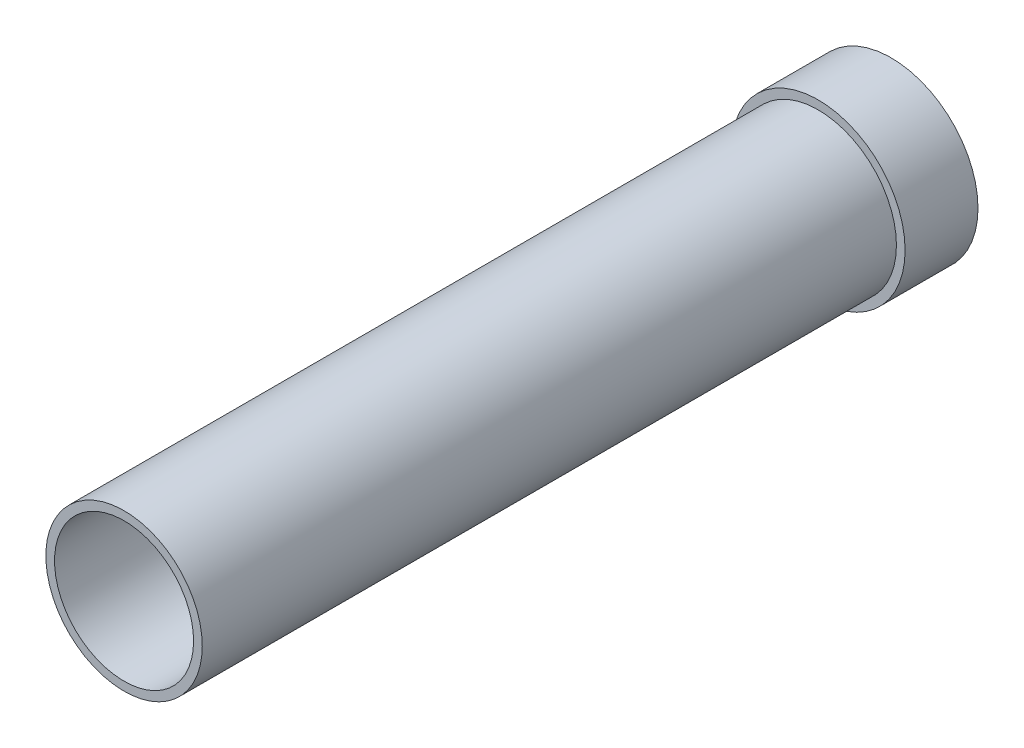
ISO-10303-21;
HEADER;
FILE_DESCRIPTION(('STEP AP214'),'2;1');
FILE_NAME('part.step','',(''),(''),'','','');
FILE_SCHEMA(('AUTOMOTIVE_DESIGN { 1 0 10303 214 1 1 1 1 }'));
ENDSEC;
DATA;
#1=APPLICATION_CONTEXT('core data for automotive mechanical design processes');
#2=APPLICATION_PROTOCOL_DEFINITION('international standard','automotive_design',2000,#1);
#3=PRODUCT_CONTEXT('',#1,'mechanical');
#4=PRODUCT('Part','Part','',(#3));
#5=PRODUCT_RELATED_PRODUCT_CATEGORY('part','',(#4));
#6=PRODUCT_DEFINITION_FORMATION('','',#4);
#7=PRODUCT_DEFINITION_CONTEXT('part definition',#1,'design');
#8=PRODUCT_DEFINITION('design','',#6,#7);
#9=PRODUCT_DEFINITION_SHAPE('','',#8);
#10=(LENGTH_UNIT() NAMED_UNIT(*) SI_UNIT(.MILLI.,.METRE.));
#11=(NAMED_UNIT(*) PLANE_ANGLE_UNIT() SI_UNIT($,.RADIAN.));
#12=(NAMED_UNIT(*) SI_UNIT($,.STERADIAN.) SOLID_ANGLE_UNIT());
#13=UNCERTAINTY_MEASURE_WITH_UNIT(LENGTH_MEASURE(1.E-05),#10,'distance_accuracy_value','');
#14=(GEOMETRIC_REPRESENTATION_CONTEXT(3) GLOBAL_UNCERTAINTY_ASSIGNED_CONTEXT((#13)) GLOBAL_UNIT_ASSIGNED_CONTEXT((#10,
#11,#12)) REPRESENTATION_CONTEXT('',''));
#15=CARTESIAN_POINT('',(0.,0.,0.));
#16=DIRECTION('',(0.,0.,1.));
#17=DIRECTION('',(1.,0.,0.));
#18=AXIS2_PLACEMENT_3D('',#15,#16,#17);
#19=CARTESIAN_POINT('',(672.464575935426,-1215.75098481151,40.64));
#20=DIRECTION('',(0.,0.,-1.));
#21=DIRECTION('',(-1.,0.,0.));
#22=AXIS2_PLACEMENT_3D('',#19,#20,#21);
#23=CYLINDRICAL_SURFACE('',#22,63.5820501252049);
#24=CARTESIAN_POINT('',(672.464575935426,-1215.75098481151,38.1));
#25=DIRECTION('',(0.,0.,1.));
#26=DIRECTION('',(1.,0.,0.));
#27=AXIS2_PLACEMENT_3D('',#24,#25,#26);
#28=CIRCLE('',#27,63.5820501252049);
#29=CARTESIAN_POINT('',(736.046626060631,-1215.75098481151,38.1));
#30=VERTEX_POINT('',#29);
#31=EDGE_CURVE('E10',#30,#30,#28,.T.);
#32=ORIENTED_EDGE('',*,*,#31,.T.);
#33=EDGE_LOOP('',(#32));
#34=FACE_BOUND('',#33,.T.);
#35=CARTESIAN_POINT('',(672.464575935426,-1215.75098481151,91.44));
#36=DIRECTION('',(0.,0.,1.));
#37=DIRECTION('',(1.,0.,0.));
#38=AXIS2_PLACEMENT_3D('',#35,#36,#37);
#39=CIRCLE('',#38,63.5820501252049);
#40=CARTESIAN_POINT('',(736.046626060631,-1215.75098481151,91.44));
#41=VERTEX_POINT('',#40);
#42=EDGE_CURVE('E50',#41,#41,#39,.T.);
#43=ORIENTED_EDGE('',*,*,#42,.F.);
#44=EDGE_LOOP('',(#43));
#45=FACE_BOUND('',#44,.T.);
#46=ADVANCED_FACE('F43',(#34,#45),#23,.T.);
#47=CARTESIAN_POINT('',(672.464575935426,-1215.75098481151,152.276165903212));
#48=DIRECTION('',(0.,0.,1.));
#49=DIRECTION('',(1.,0.,0.));
#50=AXIS2_PLACEMENT_3D('',#47,#48,#49);
#51=SPHERICAL_SURFACE('',#50,130.686165903212);
#52=ORIENTED_EDGE('',*,*,#31,.F.);
#53=EDGE_LOOP('',(#52));
#54=FACE_BOUND('',#53,.T.);
#55=ADVANCED_FACE('F45',(#54),#51,.T.);
#56=CARTESIAN_POINT('',(672.464575935426,-1215.75098481151,91.44));
#57=DIRECTION('',(0.,0.,1.));
#58=DIRECTION('',(1.,0.,0.));
#59=AXIS2_PLACEMENT_3D('',#56,#57,#58);
#60=PLANE('',#59);
#61=ORIENTED_EDGE('',*,*,#42,.T.);
#62=EDGE_LOOP('',(#61));
#63=FACE_BOUND('',#62,.T.);
#64=CARTESIAN_POINT('',(672.464575935426,-1215.75098481151,91.44));
#65=DIRECTION('',(0.,0.,1.));
#66=DIRECTION('',(1.,0.,0.));
#67=AXIS2_PLACEMENT_3D('',#64,#65,#66);
#68=CIRCLE('',#67,57.2320501252049);
#69=CARTESIAN_POINT('',(729.696626060631,-1215.75098481151,91.44));
#70=VERTEX_POINT('',#69);
#71=EDGE_CURVE('E54',#70,#70,#68,.T.);
#72=ORIENTED_EDGE('',*,*,#71,.F.);
#73=EDGE_LOOP('',(#72));
#74=FACE_BOUND('',#73,.T.);
#75=ADVANCED_FACE('F100',(#63,#74),#60,.T.);
#76=CARTESIAN_POINT('',(672.464575935426,-1215.75098481151,599.44));
#77=DIRECTION('',(0.,0.,1.));
#78=DIRECTION('',(1.,0.,0.));
#79=AXIS2_PLACEMENT_3D('',#76,#77,#78);
#80=PLANE('',#79);
#81=CARTESIAN_POINT('',(672.464575935426,-1215.75098481151,599.44));
#82=DIRECTION('',(0.,0.,1.));
#83=DIRECTION('',(1.,0.,0.));
#84=AXIS2_PLACEMENT_3D('',#81,#82,#83);
#85=CIRCLE('',#84,50.8820501252048);
#86=CARTESIAN_POINT('',(723.346626060631,-1215.75098481151,599.44));
#87=VERTEX_POINT('',#86);
#88=EDGE_CURVE('E64',#87,#87,#85,.T.);
#89=ORIENTED_EDGE('',*,*,#88,.F.);
#90=EDGE_LOOP('',(#89));
#91=FACE_BOUND('',#90,.T.);
#92=CARTESIAN_POINT('',(672.464575935426,-1215.75098481151,599.44));
#93=DIRECTION('',(0.,0.,1.));
#94=DIRECTION('',(1.,0.,0.));
#95=AXIS2_PLACEMENT_3D('',#92,#93,#94);
#96=CIRCLE('',#95,57.2320501252048);
#97=CARTESIAN_POINT('',(729.696626060631,-1215.75098481151,599.44));
#98=VERTEX_POINT('',#97);
#99=EDGE_CURVE('E58',#98,#98,#96,.T.);
#100=ORIENTED_EDGE('',*,*,#99,.T.);
#101=EDGE_LOOP('',(#100));
#102=FACE_BOUND('',#101,.T.);
#103=ADVANCED_FACE('F97',(#91,#102),#80,.T.);
#104=CARTESIAN_POINT('',(672.464575935426,-1215.75098481151,599.44));
#105=DIRECTION('',(0.,0.,-1.));
#106=DIRECTION('',(-1.,0.,0.));
#107=AXIS2_PLACEMENT_3D('',#104,#105,#106);
#108=CYLINDRICAL_SURFACE('',#107,57.2320501252048);
#109=ORIENTED_EDGE('',*,*,#71,.T.);
#110=EDGE_LOOP('',(#109));
#111=FACE_BOUND('',#110,.T.);
#112=ORIENTED_EDGE('',*,*,#99,.F.);
#113=EDGE_LOOP('',(#112));
#114=FACE_BOUND('',#113,.T.);
#115=ADVANCED_FACE('F81',(#111,#114),#108,.T.);
#116=CARTESIAN_POINT('',(672.464575935426,-1215.75098481151,40.64));
#117=DIRECTION('',(0.,0.,-1.));
#118=DIRECTION('',(-1.,0.,0.));
#119=AXIS2_PLACEMENT_3D('',#116,#117,#118);
#120=CYLINDRICAL_SURFACE('',#119,57.2320501252049);
#121=CARTESIAN_POINT('',(672.464575935426,-1215.75098481151,41.895123192169));
#122=DIRECTION('',(0.,0.,1.));
#123=DIRECTION('',(1.,0.,0.));
#124=AXIS2_PLACEMENT_3D('',#121,#122,#123);
#125=CIRCLE('',#124,57.2320501252049);
#126=CARTESIAN_POINT('',(729.696626060631,-1215.75098481151,41.895123192169));
#127=VERTEX_POINT('',#126);
#128=EDGE_CURVE('E63',#127,#127,#125,.T.);
#129=ORIENTED_EDGE('',*,*,#128,.F.);
#130=EDGE_LOOP('',(#129));
#131=FACE_BOUND('',#130,.T.);
#132=CARTESIAN_POINT('',(672.464575935426,-1215.75098481151,85.09));
#133=DIRECTION('',(0.,0.,1.));
#134=DIRECTION('',(1.,0.,0.));
#135=AXIS2_PLACEMENT_3D('',#132,#133,#134);
#136=CIRCLE('',#135,57.2320501252049);
#137=CARTESIAN_POINT('',(729.696626060631,-1215.75098481151,85.09));
#138=VERTEX_POINT('',#137);
#139=EDGE_CURVE('E70',#138,#138,#136,.T.);
#140=ORIENTED_EDGE('',*,*,#139,.T.);
#141=EDGE_LOOP('',(#140));
#142=FACE_BOUND('',#141,.T.);
#143=ADVANCED_FACE('F78',(#131,#142),#120,.F.);
#144=CARTESIAN_POINT('',(672.464575935426,-1215.75098481151,152.276165903212));
#145=DIRECTION('',(0.,0.,1.));
#146=DIRECTION('',(1.,0.,0.));
#147=AXIS2_PLACEMENT_3D('',#144,#145,#146);
#148=SPHERICAL_SURFACE('',#147,124.336165903212);
#149=ORIENTED_EDGE('',*,*,#128,.T.);
#150=EDGE_LOOP('',(#149));
#151=FACE_BOUND('',#150,.T.);
#152=ADVANCED_FACE('F76',(#151),#148,.F.);
#153=CARTESIAN_POINT('',(672.464575935426,-1215.75098481151,85.09));
#154=DIRECTION('',(0.,0.,1.));
#155=DIRECTION('',(1.,0.,0.));
#156=AXIS2_PLACEMENT_3D('',#153,#154,#155);
#157=PLANE('',#156);
#158=ORIENTED_EDGE('',*,*,#139,.F.);
#159=EDGE_LOOP('',(#158));
#160=FACE_BOUND('',#159,.T.);
#161=CARTESIAN_POINT('',(672.464575935426,-1215.75098481151,85.09));
#162=DIRECTION('',(0.,0.,1.));
#163=DIRECTION('',(1.,0.,0.));
#164=AXIS2_PLACEMENT_3D('',#161,#162,#163);
#165=CIRCLE('',#164,50.8820501252048);
#166=CARTESIAN_POINT('',(723.346626060631,-1215.75098481151,85.09));
#167=VERTEX_POINT('',#166);
#168=EDGE_CURVE('E67',#167,#167,#165,.T.);
#169=ORIENTED_EDGE('',*,*,#168,.T.);
#170=EDGE_LOOP('',(#169));
#171=FACE_BOUND('',#170,.T.);
#172=ADVANCED_FACE('F85',(#160,#171),#157,.F.);
#173=CARTESIAN_POINT('',(672.464575935426,-1215.75098481151,599.44));
#174=DIRECTION('',(0.,0.,-1.));
#175=DIRECTION('',(-1.,0.,0.));
#176=AXIS2_PLACEMENT_3D('',#173,#174,#175);
#177=CYLINDRICAL_SURFACE('',#176,50.8820501252048);
#178=ORIENTED_EDGE('',*,*,#168,.F.);
#179=EDGE_LOOP('',(#178));
#180=FACE_BOUND('',#179,.T.);
#181=ORIENTED_EDGE('',*,*,#88,.T.);
#182=EDGE_LOOP('',(#181));
#183=FACE_BOUND('',#182,.T.);
#184=ADVANCED_FACE('F88',(#180,#183),#177,.F.);
#185=CLOSED_SHELL('',(#46,#55,#75,#103,#115,#143,#152,#172,#184));
#186=MANIFOLD_SOLID_BREP('B2',#185);
#187=ADVANCED_BREP_SHAPE_REPRESENTATION('',(#18,#186),#14);
#188=SHAPE_DEFINITION_REPRESENTATION(#9,#187);
ENDSEC;
END-ISO-10303-21;
